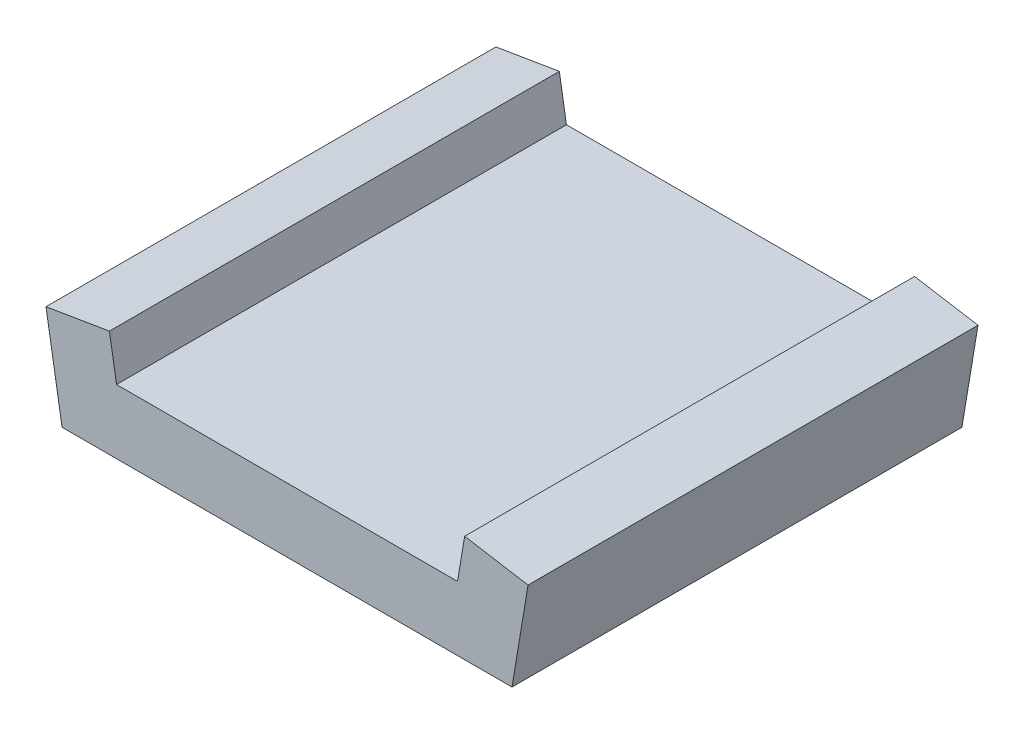
ISO-10303-21;
HEADER;
FILE_DESCRIPTION(('STEP AP214'),'2;1');
FILE_NAME('part.step','',(''),(''),'','','');
FILE_SCHEMA(('AUTOMOTIVE_DESIGN { 1 0 10303 214 1 1 1 1 }'));
ENDSEC;
DATA;
#1=APPLICATION_CONTEXT('core data for automotive mechanical design processes');
#2=APPLICATION_PROTOCOL_DEFINITION('international standard','automotive_design',2000,#1);
#3=PRODUCT_CONTEXT('',#1,'mechanical');
#4=PRODUCT('Part','Part','',(#3));
#5=PRODUCT_RELATED_PRODUCT_CATEGORY('part','',(#4));
#6=PRODUCT_DEFINITION_FORMATION('','',#4);
#7=PRODUCT_DEFINITION_CONTEXT('part definition',#1,'design');
#8=PRODUCT_DEFINITION('design','',#6,#7);
#9=PRODUCT_DEFINITION_SHAPE('','',#8);
#10=(LENGTH_UNIT() NAMED_UNIT(*) SI_UNIT(.MILLI.,.METRE.));
#11=(NAMED_UNIT(*) PLANE_ANGLE_UNIT() SI_UNIT($,.RADIAN.));
#12=(NAMED_UNIT(*) SI_UNIT($,.STERADIAN.) SOLID_ANGLE_UNIT());
#13=UNCERTAINTY_MEASURE_WITH_UNIT(LENGTH_MEASURE(1.E-05),#10,'distance_accuracy_value','');
#14=(GEOMETRIC_REPRESENTATION_CONTEXT(3) GLOBAL_UNCERTAINTY_ASSIGNED_CONTEXT((#13)) GLOBAL_UNIT_ASSIGNED_CONTEXT((#10,
#11,#12)) REPRESENTATION_CONTEXT('',''));
#15=CARTESIAN_POINT('',(0.,0.,0.));
#16=DIRECTION('',(0.,0.,1.));
#17=DIRECTION('',(1.,0.,0.));
#18=AXIS2_PLACEMENT_3D('',#15,#16,#17);
#19=CARTESIAN_POINT('',(6.,-2.5,13.5));
#20=DIRECTION('',(0.986393923832144,0.164398987305358,0.));
#21=DIRECTION('',(-0.164398987305358,0.986393923832144,0.));
#22=AXIS2_PLACEMENT_3D('',#19,#20,#21);
#23=PLANE('',#22);
#24=DIRECTION('',(-0.164398987305358,0.986393923832144,0.));
#25=VECTOR('',#24,1.);
#26=CARTESIAN_POINT('',(6.,-2.5,20.5));
#27=LINE('',#26,#25);
#28=CARTESIAN_POINT('',(6.,-2.5,20.5));
#29=VERTEX_POINT('',#28);
#30=CARTESIAN_POINT('',(5.75,-1.,20.5));
#31=VERTEX_POINT('',#30);
#32=EDGE_CURVE('E123',#29,#31,#27,.T.);
#33=ORIENTED_EDGE('',*,*,#32,.T.);
#34=DIRECTION('',(0.,0.,1.));
#35=VECTOR('',#34,1.);
#36=CARTESIAN_POINT('',(5.75,-1.,13.5));
#37=LINE('',#36,#35);
#38=CARTESIAN_POINT('',(5.75,-1.,13.5));
#39=VERTEX_POINT('',#38);
#40=EDGE_CURVE('E11',#39,#31,#37,.T.);
#41=ORIENTED_EDGE('',*,*,#40,.F.);
#42=DIRECTION('',(-0.164398987305358,0.986393923832144,0.));
#43=VECTOR('',#42,1.);
#44=CARTESIAN_POINT('',(6.,-2.5,13.5));
#45=LINE('',#44,#43);
#46=CARTESIAN_POINT('',(6.,-2.5,13.5));
#47=VERTEX_POINT('',#46);
#48=EDGE_CURVE('E145',#47,#39,#45,.T.);
#49=ORIENTED_EDGE('',*,*,#48,.F.);
#50=DIRECTION('',(0.,0.,1.));
#51=VECTOR('',#50,1.);
#52=CARTESIAN_POINT('',(6.,-2.5,13.5));
#53=LINE('',#52,#51);
#54=EDGE_CURVE('E19',#47,#29,#53,.T.);
#55=ORIENTED_EDGE('',*,*,#54,.T.);
#56=EDGE_LOOP('',(#33,#41,#49,#55));
#57=FACE_BOUND('',#56,.T.);
#58=ADVANCED_FACE('F16',(#57),#23,.F.);
#59=CARTESIAN_POINT('',(5.75,-1.,13.5));
#60=DIRECTION('',(0.164398987305354,-0.986393923832144,0.));
#61=DIRECTION('',(0.986393923832144,0.164398987305354,0.));
#62=AXIS2_PLACEMENT_3D('',#59,#60,#61);
#63=PLANE('',#62);
#64=DIRECTION('',(0.986393923832144,0.164398987305354,0.));
#65=VECTOR('',#64,1.);
#66=CARTESIAN_POINT('',(5.75,-1.,20.5));
#67=LINE('',#66,#65);
#68=CARTESIAN_POINT('',(6.73639392383215,-0.835601012694639,20.5));
#69=VERTEX_POINT('',#68);
#70=EDGE_CURVE('E127',#31,#69,#67,.T.);
#71=ORIENTED_EDGE('',*,*,#70,.T.);
#72=DIRECTION('',(0.,0.,1.));
#73=VECTOR('',#72,1.);
#74=CARTESIAN_POINT('',(6.73639392383215,-0.835601012694639,13.5));
#75=LINE('',#74,#73);
#76=CARTESIAN_POINT('',(6.73639392383215,-0.835601012694639,13.5));
#77=VERTEX_POINT('',#76);
#78=EDGE_CURVE('E26',#77,#69,#75,.T.);
#79=ORIENTED_EDGE('',*,*,#78,.F.);
#80=DIRECTION('',(0.986393923832144,0.164398987305354,0.));
#81=VECTOR('',#80,1.);
#82=CARTESIAN_POINT('',(5.75,-1.,13.5));
#83=LINE('',#82,#81);
#84=EDGE_CURVE('E176',#39,#77,#83,.T.);
#85=ORIENTED_EDGE('',*,*,#84,.F.);
#86=ORIENTED_EDGE('',*,*,#40,.T.);
#87=EDGE_LOOP('',(#71,#79,#85,#86));
#88=FACE_BOUND('',#87,.T.);
#89=ADVANCED_FACE('F186',(#88),#63,.F.);
#90=CARTESIAN_POINT('',(6.73639392383215,-0.835601012694639,13.5));
#91=DIRECTION('',(-0.986393923832144,-0.164398987305356,0.));
#92=DIRECTION('',(0.164398987305356,-0.986393923832144,0.));
#93=AXIS2_PLACEMENT_3D('',#90,#91,#92);
#94=PLANE('',#93);
#95=DIRECTION('',(0.164398987305356,-0.986393923832144,0.));
#96=VECTOR('',#95,1.);
#97=CARTESIAN_POINT('',(6.73639392383215,-0.835601012694639,20.5));
#98=LINE('',#97,#96);
#99=CARTESIAN_POINT('',(6.84712708838304,-1.49999999999999,20.5));
#100=VERTEX_POINT('',#99);
#101=EDGE_CURVE('E130',#69,#100,#98,.T.);
#102=ORIENTED_EDGE('',*,*,#101,.T.);
#103=DIRECTION('',(0.,0.,1.));
#104=VECTOR('',#103,1.);
#105=CARTESIAN_POINT('',(6.84712708838304,-1.49999999999999,13.5));
#106=LINE('',#105,#104);
#107=CARTESIAN_POINT('',(6.84712708838304,-1.49999999999999,13.5));
#108=VERTEX_POINT('',#107);
#109=EDGE_CURVE('E153',#108,#100,#106,.T.);
#110=ORIENTED_EDGE('',*,*,#109,.F.);
#111=DIRECTION('',(0.164398987305356,-0.986393923832144,0.));
#112=VECTOR('',#111,1.);
#113=CARTESIAN_POINT('',(6.73639392383215,-0.835601012694639,13.5));
#114=LINE('',#113,#112);
#115=EDGE_CURVE('E165',#77,#108,#114,.T.);
#116=ORIENTED_EDGE('',*,*,#115,.F.);
#117=ORIENTED_EDGE('',*,*,#78,.T.);
#118=EDGE_LOOP('',(#102,#110,#116,#117));
#119=FACE_BOUND('',#118,.T.);
#120=ADVANCED_FACE('F163',(#119),#94,.F.);
#121=CARTESIAN_POINT('',(6.84712708838304,-1.49999999999999,13.5));
#122=DIRECTION('',(0.,-1.,0.));
#123=DIRECTION('',(0.,0.,-1.));
#124=AXIS2_PLACEMENT_3D('',#121,#122,#123);
#125=PLANE('',#124);
#126=DIRECTION('',(1.,0.,0.));
#127=VECTOR('',#126,1.);
#128=CARTESIAN_POINT('',(6.84712708838304,-1.49999999999999,20.5));
#129=LINE('',#128,#127);
#130=CARTESIAN_POINT('',(12.152872911617,-1.49999999999999,20.5));
#131=VERTEX_POINT('',#130);
#132=EDGE_CURVE('E133',#100,#131,#129,.T.);
#133=ORIENTED_EDGE('',*,*,#132,.T.);
#134=DIRECTION('',(0.,0.,1.));
#135=VECTOR('',#134,1.);
#136=CARTESIAN_POINT('',(12.152872911617,-1.49999999999999,13.5));
#137=LINE('',#136,#135);
#138=CARTESIAN_POINT('',(12.152872911617,-1.49999999999999,13.5));
#139=VERTEX_POINT('',#138);
#140=EDGE_CURVE('E107',#139,#131,#137,.T.);
#141=ORIENTED_EDGE('',*,*,#140,.F.);
#142=DIRECTION('',(1.,0.,0.));
#143=VECTOR('',#142,1.);
#144=CARTESIAN_POINT('',(6.84712708838304,-1.49999999999999,13.5));
#145=LINE('',#144,#143);
#146=EDGE_CURVE('E96',#108,#139,#145,.T.);
#147=ORIENTED_EDGE('',*,*,#146,.F.);
#148=ORIENTED_EDGE('',*,*,#109,.T.);
#149=EDGE_LOOP('',(#133,#141,#147,#148));
#150=FACE_BOUND('',#149,.T.);
#151=ADVANCED_FACE('F172',(#150),#125,.F.);
#152=CARTESIAN_POINT('',(12.152872911617,-1.49999999999999,13.5));
#153=DIRECTION('',(0.986393923832144,-0.164398987305356,0.));
#154=DIRECTION('',(0.164398987305356,0.986393923832144,0.));
#155=AXIS2_PLACEMENT_3D('',#152,#153,#154);
#156=PLANE('',#155);
#157=DIRECTION('',(0.164398987305356,0.986393923832144,0.));
#158=VECTOR('',#157,1.);
#159=CARTESIAN_POINT('',(12.152872911617,-1.49999999999999,20.5));
#160=LINE('',#159,#158);
#161=CARTESIAN_POINT('',(12.2636060761679,-0.835601012694638,20.5));
#162=VERTEX_POINT('',#161);
#163=EDGE_CURVE('E105',#131,#162,#160,.T.);
#164=ORIENTED_EDGE('',*,*,#163,.T.);
#165=DIRECTION('',(0.,0.,1.));
#166=VECTOR('',#165,1.);
#167=CARTESIAN_POINT('',(12.2636060761679,-0.835601012694638,13.5));
#168=LINE('',#167,#166);
#169=CARTESIAN_POINT('',(12.2636060761679,-0.835601012694638,13.5));
#170=VERTEX_POINT('',#169);
#171=EDGE_CURVE('E102',#170,#162,#168,.T.);
#172=ORIENTED_EDGE('',*,*,#171,.F.);
#173=DIRECTION('',(0.164398987305356,0.986393923832144,0.));
#174=VECTOR('',#173,1.);
#175=CARTESIAN_POINT('',(12.152872911617,-1.49999999999999,13.5));
#176=LINE('',#175,#174);
#177=EDGE_CURVE('E90',#139,#170,#176,.T.);
#178=ORIENTED_EDGE('',*,*,#177,.F.);
#179=ORIENTED_EDGE('',*,*,#140,.T.);
#180=EDGE_LOOP('',(#164,#172,#178,#179));
#181=FACE_BOUND('',#180,.T.);
#182=ADVANCED_FACE('F103',(#181),#156,.F.);
#183=CARTESIAN_POINT('',(12.2636060761679,-0.835601012694639,13.5));
#184=DIRECTION('',(-0.164398987305354,-0.986393923832144,0.));
#185=DIRECTION('',(0.986393923832144,-0.164398987305354,0.));
#186=AXIS2_PLACEMENT_3D('',#183,#184,#185);
#187=PLANE('',#186);
#188=DIRECTION('',(0.986393923832144,-0.164398987305354,0.));
#189=VECTOR('',#188,1.);
#190=CARTESIAN_POINT('',(12.2636060761679,-0.835601012694639,20.5));
#191=LINE('',#190,#189);
#192=CARTESIAN_POINT('',(13.25,-1.,20.5));
#193=VERTEX_POINT('',#192);
#194=EDGE_CURVE('E63',#162,#193,#191,.T.);
#195=ORIENTED_EDGE('',*,*,#194,.T.);
#196=DIRECTION('',(0.,0.,1.));
#197=VECTOR('',#196,1.);
#198=CARTESIAN_POINT('',(13.25,-1.,13.5));
#199=LINE('',#198,#197);
#200=CARTESIAN_POINT('',(13.25,-1.,13.5));
#201=VERTEX_POINT('',#200);
#202=EDGE_CURVE('E108',#201,#193,#199,.T.);
#203=ORIENTED_EDGE('',*,*,#202,.F.);
#204=DIRECTION('',(0.986393923832144,-0.164398987305354,0.));
#205=VECTOR('',#204,1.);
#206=CARTESIAN_POINT('',(12.2636060761679,-0.835601012694639,13.5));
#207=LINE('',#206,#205);
#208=EDGE_CURVE('E94',#170,#201,#207,.T.);
#209=ORIENTED_EDGE('',*,*,#208,.F.);
#210=ORIENTED_EDGE('',*,*,#171,.T.);
#211=EDGE_LOOP('',(#195,#203,#209,#210));
#212=FACE_BOUND('',#211,.T.);
#213=ADVANCED_FACE('F110',(#212),#187,.F.);
#214=CARTESIAN_POINT('',(13.25,-1.,13.5));
#215=DIRECTION('',(-0.986393923832144,0.164398987305358,0.));
#216=DIRECTION('',(-0.164398987305358,-0.986393923832144,0.));
#217=AXIS2_PLACEMENT_3D('',#214,#215,#216);
#218=PLANE('',#217);
#219=DIRECTION('',(-0.164398987305358,-0.986393923832144,0.));
#220=VECTOR('',#219,1.);
#221=CARTESIAN_POINT('',(13.25,-1.,20.5));
#222=LINE('',#221,#220);
#223=CARTESIAN_POINT('',(13.,-2.5,20.5));
#224=VERTEX_POINT('',#223);
#225=EDGE_CURVE('E69',#193,#224,#222,.T.);
#226=ORIENTED_EDGE('',*,*,#225,.T.);
#227=DIRECTION('',(0.,0.,1.));
#228=VECTOR('',#227,1.);
#229=CARTESIAN_POINT('',(13.,-2.5,13.5));
#230=LINE('',#229,#228);
#231=CARTESIAN_POINT('',(13.,-2.5,13.5));
#232=VERTEX_POINT('',#231);
#233=EDGE_CURVE('E146',#232,#224,#230,.T.);
#234=ORIENTED_EDGE('',*,*,#233,.F.);
#235=DIRECTION('',(-0.164398987305358,-0.986393923832144,0.));
#236=VECTOR('',#235,1.);
#237=CARTESIAN_POINT('',(13.25,-1.,13.5));
#238=LINE('',#237,#236);
#239=EDGE_CURVE('E34',#201,#232,#238,.T.);
#240=ORIENTED_EDGE('',*,*,#239,.F.);
#241=ORIENTED_EDGE('',*,*,#202,.T.);
#242=EDGE_LOOP('',(#226,#234,#240,#241));
#243=FACE_BOUND('',#242,.T.);
#244=ADVANCED_FACE('F201',(#243),#218,.F.);
#245=CARTESIAN_POINT('',(13.,-2.5,13.5));
#246=DIRECTION('',(0.,1.,0.));
#247=DIRECTION('',(0.,0.,1.));
#248=AXIS2_PLACEMENT_3D('',#245,#246,#247);
#249=PLANE('',#248);
#250=DIRECTION('',(-1.,0.,0.));
#251=VECTOR('',#250,1.);
#252=CARTESIAN_POINT('',(13.,-2.5,20.5));
#253=LINE('',#252,#251);
#254=EDGE_CURVE('E142',#224,#29,#253,.T.);
#255=ORIENTED_EDGE('',*,*,#254,.T.);
#256=ORIENTED_EDGE('',*,*,#54,.F.);
#257=DIRECTION('',(-1.,0.,0.));
#258=VECTOR('',#257,1.);
#259=CARTESIAN_POINT('',(13.,-2.5,13.5));
#260=LINE('',#259,#258);
#261=EDGE_CURVE('E75',#232,#47,#260,.T.);
#262=ORIENTED_EDGE('',*,*,#261,.F.);
#263=ORIENTED_EDGE('',*,*,#233,.T.);
#264=EDGE_LOOP('',(#255,#256,#262,#263));
#265=FACE_BOUND('',#264,.T.);
#266=ADVANCED_FACE('F204',(#265),#249,.F.);
#267=CARTESIAN_POINT('',(0.,1.14773055924088E-13,13.5));
#268=DIRECTION('',(0.,0.,-1.));
#269=DIRECTION('',(0.,1.,0.));
#270=AXIS2_PLACEMENT_3D('',#267,#268,#269);
#271=PLANE('',#270);
#272=ORIENTED_EDGE('',*,*,#48,.T.);
#273=ORIENTED_EDGE('',*,*,#84,.T.);
#274=ORIENTED_EDGE('',*,*,#115,.T.);
#275=ORIENTED_EDGE('',*,*,#146,.T.);
#276=ORIENTED_EDGE('',*,*,#177,.T.);
#277=ORIENTED_EDGE('',*,*,#208,.T.);
#278=ORIENTED_EDGE('',*,*,#239,.T.);
#279=ORIENTED_EDGE('',*,*,#261,.T.);
#280=EDGE_LOOP('',(#272,#273,#274,#275,#276,#277,#278,#279));
#281=FACE_BOUND('',#280,.T.);
#282=ADVANCED_FACE('F92',(#281),#271,.T.);
#283=CARTESIAN_POINT('',(0.,1.14773055924088E-13,20.5));
#284=DIRECTION('',(0.,0.,-1.));
#285=DIRECTION('',(0.,1.,0.));
#286=AXIS2_PLACEMENT_3D('',#283,#284,#285);
#287=PLANE('',#286);
#288=ORIENTED_EDGE('',*,*,#32,.F.);
#289=ORIENTED_EDGE('',*,*,#254,.F.);
#290=ORIENTED_EDGE('',*,*,#225,.F.);
#291=ORIENTED_EDGE('',*,*,#194,.F.);
#292=ORIENTED_EDGE('',*,*,#163,.F.);
#293=ORIENTED_EDGE('',*,*,#132,.F.);
#294=ORIENTED_EDGE('',*,*,#101,.F.);
#295=ORIENTED_EDGE('',*,*,#70,.F.);
#296=EDGE_LOOP('',(#288,#289,#290,#291,#292,#293,#294,#295));
#297=FACE_BOUND('',#296,.T.);
#298=ADVANCED_FACE('F170',(#297),#287,.F.);
#299=CLOSED_SHELL('',(#58,#89,#120,#151,#182,#213,#244,#266,#282,#298));
#300=MANIFOLD_SOLID_BREP('B1',#299);
#301=ADVANCED_BREP_SHAPE_REPRESENTATION('',(#18,#300),#14);
#302=SHAPE_DEFINITION_REPRESENTATION(#9,#301);
ENDSEC;
END-ISO-10303-21;
